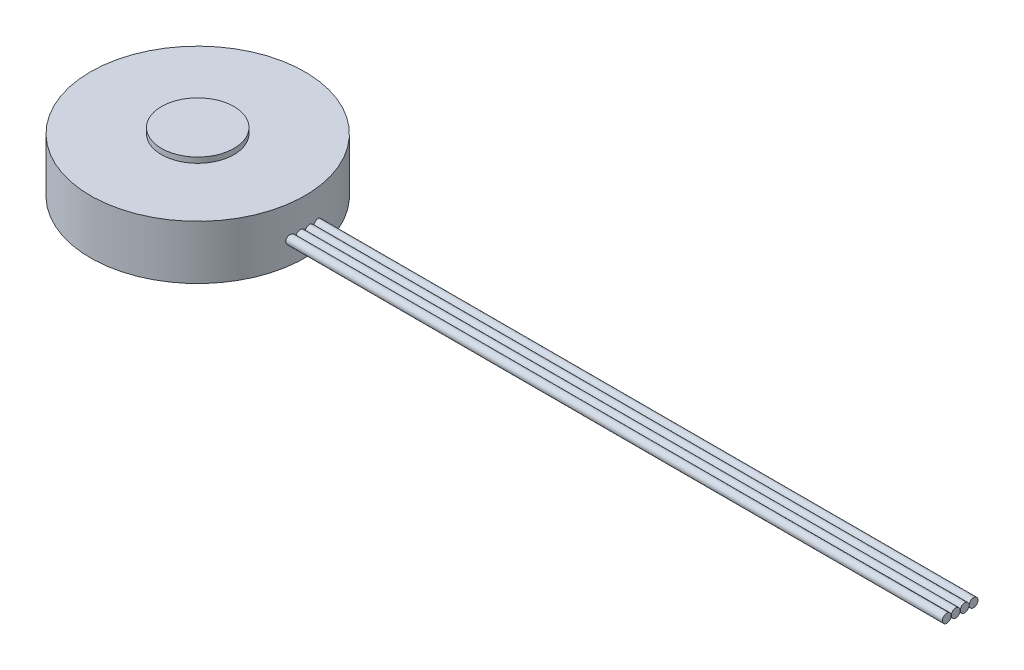
ISO-10303-21;
HEADER;
FILE_DESCRIPTION(('STEP AP214'),'2;1');
FILE_NAME('part.step','',(''),(''),'','','');
FILE_SCHEMA(('AUTOMOTIVE_DESIGN { 1 0 10303 214 1 1 1 1 }'));
ENDSEC;
DATA;
#1=APPLICATION_CONTEXT('core data for automotive mechanical design processes');
#2=APPLICATION_PROTOCOL_DEFINITION('international standard','automotive_design',2000,#1);
#3=PRODUCT_CONTEXT('',#1,'mechanical');
#4=PRODUCT('Part','Part','',(#3));
#5=PRODUCT_RELATED_PRODUCT_CATEGORY('part','',(#4));
#6=PRODUCT_DEFINITION_FORMATION('','',#4);
#7=PRODUCT_DEFINITION_CONTEXT('part definition',#1,'design');
#8=PRODUCT_DEFINITION('design','',#6,#7);
#9=PRODUCT_DEFINITION_SHAPE('','',#8);
#10=(LENGTH_UNIT() NAMED_UNIT(*) SI_UNIT(.MILLI.,.METRE.));
#11=(NAMED_UNIT(*) PLANE_ANGLE_UNIT() SI_UNIT($,.RADIAN.));
#12=(NAMED_UNIT(*) SI_UNIT($,.STERADIAN.) SOLID_ANGLE_UNIT());
#13=UNCERTAINTY_MEASURE_WITH_UNIT(LENGTH_MEASURE(1.E-05),#10,'distance_accuracy_value','');
#14=(GEOMETRIC_REPRESENTATION_CONTEXT(3) GLOBAL_UNCERTAINTY_ASSIGNED_CONTEXT((#13)) GLOBAL_UNIT_ASSIGNED_CONTEXT((#10,
#11,#12)) REPRESENTATION_CONTEXT('',''));
#15=CARTESIAN_POINT('',(0.,0.,0.));
#16=DIRECTION('',(0.,0.,1.));
#17=DIRECTION('',(1.,0.,0.));
#18=AXIS2_PLACEMENT_3D('',#15,#16,#17);
#19=CARTESIAN_POINT('',(0.,5.45,0.));
#20=DIRECTION('',(0.,1.,0.));
#21=DIRECTION('',(-1.,0.,0.));
#22=AXIS2_PLACEMENT_3D('',#19,#20,#21);
#23=CYLINDRICAL_SURFACE('',#22,9.85);
#24=CARTESIAN_POINT('',(9.71335549642862,2.05,1.635));
#25=CARTESIAN_POINT('',(9.71335574145579,2.07253117408199,1.63499896580258));
#26=CARTESIAN_POINT('',(9.71367369977142,2.09507858684365,1.63311305803533));
#27=CARTESIAN_POINT('',(9.71493029272329,2.13954715885051,1.62562088433148));
#28=CARTESIAN_POINT('',(9.71586966723387,2.16146753903822,1.62001018353071));
#29=CARTESIAN_POINT('',(9.71832031769955,2.20402672120731,1.60524323753193));
#30=CARTESIAN_POINT('',(9.7198311272243,2.22466655247768,1.59608988386134));
#31=CARTESIAN_POINT('',(9.72334959996296,2.26410512243372,1.57451308879758));
#32=CARTESIAN_POINT('',(9.72535716029743,2.28290424121589,1.56209032448097));
#33=CARTESIAN_POINT('',(9.7297903808073,2.31828370551512,1.53423558785067));
#34=CARTESIAN_POINT('',(9.73221889197438,2.33484745412459,1.51878299502535));
#35=CARTESIAN_POINT('',(9.7373751614499,2.36515467717834,1.48536536934966));
#36=CARTESIAN_POINT('',(9.74010294942703,2.37889787161961,1.46740008735617));
#37=CARTESIAN_POINT('',(9.74577832187313,2.40334803622492,1.42922400309424));
#38=CARTESIAN_POINT('',(9.74872819081091,2.41401572162192,1.40898837376754));
#39=CARTESIAN_POINT('',(9.75470146454301,2.43179770132659,1.3670216547996));
#40=CARTESIAN_POINT('',(9.75772487270384,2.43891183263575,1.34529049661172));
#41=CARTESIAN_POINT('',(9.76375890621295,2.44942760006057,1.30077660200808));
#42=CARTESIAN_POINT('',(9.76676928188469,2.45280207604103,1.27798740889519));
#43=CARTESIAN_POINT('',(9.77265785875394,2.45564476579442,1.23214944308663));
#44=CARTESIAN_POINT('',(9.77553605992163,2.45511297868654,1.20910067033244));
#45=CARTESIAN_POINT('',(9.78107808678261,2.4501490617146,1.16341763666672));
#46=CARTESIAN_POINT('',(9.78374206972336,2.44571982184334,1.14078308130175));
#47=CARTESIAN_POINT('',(9.78879679328326,2.43307779432689,1.09656411038364));
#48=CARTESIAN_POINT('',(9.79118754150388,2.42486511197012,1.07497966562572));
#49=CARTESIAN_POINT('',(9.79564058772652,2.40493831309833,1.0336131932568));
#50=CARTESIAN_POINT('',(9.79770472902949,2.39324500515106,1.01382134117547));
#51=CARTESIAN_POINT('',(9.80149711844438,2.36666424858525,0.976476863174621));
#52=CARTESIAN_POINT('',(9.80322537814041,2.3517769101618,0.958924160037033));
#53=CARTESIAN_POINT('',(9.80632595838217,2.31933377044988,0.926678232411411));
#54=CARTESIAN_POINT('',(9.80770047968811,2.30179560178567,0.911967477215195));
#55=CARTESIAN_POINT('',(9.81010780728022,2.26447880103306,0.88569712340037));
#56=CARTESIAN_POINT('',(9.8111406217609,2.24470022268737,0.87413744921662));
#57=CARTESIAN_POINT('',(9.81286605217397,2.2035564468074,0.854550509585855));
#58=CARTESIAN_POINT('',(9.81356011333075,2.18219844522234,0.846508253315305));
#59=CARTESIAN_POINT('',(9.81462105062981,2.1384287830343,0.834117878664806));
#60=CARTESIAN_POINT('',(9.81498793097606,2.11601713597362,0.829769712819087));
#61=CARTESIAN_POINT('',(9.81539849182161,2.07082574776304,0.824899103336665));
#62=CARTESIAN_POINT('',(9.81544283438808,2.04804685689159,0.824368822821955));
#63=CARTESIAN_POINT('',(9.8152106518989,2.00272342304803,0.827128589264524));
#64=CARTESIAN_POINT('',(9.81493412859922,1.98017887879412,0.830418615314747));
#65=CARTESIAN_POINT('',(9.81405698233417,1.93597482574058,0.840721105705038));
#66=CARTESIAN_POINT('',(9.81345651064714,1.91431490890974,0.847731832516862));
#67=CARTESIAN_POINT('',(9.81192551893674,1.87248247097522,0.865271434723837));
#68=CARTESIAN_POINT('',(9.81099499911285,1.85230994897263,0.87580030799278));
#69=CARTESIAN_POINT('',(9.80879711446168,1.81400494524072,0.900081844415964));
#70=CARTESIAN_POINT('',(9.80752946138749,1.79587422821453,0.913837265055717));
#71=CARTESIAN_POINT('',(9.80465585226066,1.7621815638768,0.944168984549352));
#72=CARTESIAN_POINT('',(9.80304989348301,1.74661963725835,0.960745306125028));
#73=CARTESIAN_POINT('',(9.79950147692846,1.71845941238415,0.99628810424739));
#74=CARTESIAN_POINT('',(9.79755814979077,1.70586897412457,1.01526072048959));
#75=CARTESIAN_POINT('',(9.79335685212602,1.68404901670669,1.05501689080693));
#76=CARTESIAN_POINT('',(9.79109887488722,1.67481956925636,1.0758004835082));
#77=CARTESIAN_POINT('',(9.78629098904468,1.65993090054512,1.11869401930752));
#78=CARTESIAN_POINT('',(9.78373968981753,1.65428959012721,1.14081002228638));
#79=CARTESIAN_POINT('',(9.77840728575854,1.64679460081451,1.18564773704872));
#80=CARTESIAN_POINT('',(9.77562617169506,1.64494107415155,1.20836947313956));
#81=CARTESIAN_POINT('',(9.76988656773616,1.64506218361062,1.25393265592152));
#82=CARTESIAN_POINT('',(9.76692702896161,1.64706214838034,1.27677390378371));
#83=CARTESIAN_POINT('',(9.76093745294898,1.6548768208258,1.32178507691544));
#84=CARTESIAN_POINT('',(9.757907412906,1.66069168052866,1.34395497539424));
#85=CARTESIAN_POINT('',(9.75186632697511,1.67601117666573,1.38711233133906));
#86=CARTESIAN_POINT('',(9.74885545316627,1.68553421643345,1.40809328373897));
#87=CARTESIAN_POINT('',(9.74298487283247,1.70800530827115,1.44815612868549));
#88=CARTESIAN_POINT('',(9.74012516172939,1.72095325654303,1.46723807876072));
#89=CARTESIAN_POINT('',(9.73468132800783,1.7498995690641,1.50293231807898));
#90=CARTESIAN_POINT('',(9.73209685196158,1.76589394594046,1.51954778559338));
#91=CARTESIAN_POINT('',(9.72731654348271,1.80050613726334,1.54985448610853));
#92=CARTESIAN_POINT('',(9.72512078945526,1.81912447960608,1.56354512928768));
#93=CARTESIAN_POINT('',(9.72124258561783,1.85828111198624,1.58747874986094));
#94=CARTESIAN_POINT('',(9.71955584389194,1.87880132530525,1.59775063413169));
#95=CARTESIAN_POINT('',(9.71675702766367,1.92129736973938,1.61468488462944));
#96=CARTESIAN_POINT('',(9.71564421091544,1.94327127908705,1.6213519134879));
#97=CARTESIAN_POINT('',(9.71435259253801,1.97949478389019,1.6290678214648));
#98=CARTESIAN_POINT('',(9.71397947814716,1.99349857266224,1.63128936426203));
#99=CARTESIAN_POINT('',(9.71348085408578,2.02166610088193,1.63425577251514));
#100=CARTESIAN_POINT('',(9.7133553423277,2.03582983898003,1.63500065042078));
#101=CARTESIAN_POINT('',(9.71335549642862,2.05,1.635));
#102=B_SPLINE_CURVE_WITH_KNOTS('',3,(#24,#25,#26,#27,#28,#29,#30,#31,#32,#33,#34,#35,#36,#37,
#38,#39,#40,#41,#42,#43,#44,#45,#46,#47,#48,#49,#50,#51,#52,#53,#54,#55,#56,#57,#58,#59,#60,#61,
#62,#63,#64,#65,#66,#67,#68,#69,#70,#71,#72,#73,#74,#75,#76,#77,#78,#79,#80,#81,#82,#83,#84,#85,
#86,#87,#88,#89,#90,#91,#92,#93,#94,#95,#96,#97,#98,#99,#100,#101),.UNSPECIFIED.,.T.,.F.,(4,2,2,
2,2,2,2,2,2,2,2,2,2,2,2,2,2,2,2,2,2,2,2,2,2,2,2,2,2,2,2,2,2,2,2,2,2,2,4),(0.,0.0675413942538421,
0.135163350141083,0.202730228719375,0.270283125572725,0.338312819499713,0.406349263629962,
0.475219732724226,0.544093360558278,0.613463986491112,0.682834628066087,0.752153874054574,
0.821471191092761,0.890382151754412,0.959290735347516,1.0277596375547,1.09622689768494,
1.16439944535848,1.23257111706231,1.30060281447497,1.36863413957827,1.43663372268509,
1.50463326469613,1.57269113387005,1.64074955126251,1.70898602393598,1.77722395237447,
1.84579988365936,1.91437857097153,1.98340955780983,2.05244329576411,2.12182409999883,
2.19120280176246,2.26049131233801,2.32979378250857,2.39849443469652,2.46710601347003,
2.50958407066298,2.5520617697215),.UNSPECIFIED.);
#103=CARTESIAN_POINT('',(9.71335549642862,2.05,1.635));
#104=VERTEX_POINT('',#103);
#105=EDGE_CURVE('E106',#104,#104,#102,.T.);
#106=ORIENTED_EDGE('',*,*,#105,.T.);
#107=EDGE_LOOP('',(#106));
#108=FACE_BOUND('',#107,.T.);
#109=CARTESIAN_POINT('',(9.8162250891063,2.05,0.815000000000001));
#110=CARTESIAN_POINT('',(9.81622524391361,2.072699105565,0.814998988575934));
#111=CARTESIAN_POINT('',(9.81638465174909,2.09541445370467,0.813085174061798));
#112=CARTESIAN_POINT('',(9.81701168638832,2.14021786713435,0.805478458719045));
#113=CARTESIAN_POINT('',(9.81747967919996,2.16230515500103,0.799781070194063));
#114=CARTESIAN_POINT('',(9.81869071855766,2.20519592624566,0.784773160682826));
#115=CARTESIAN_POINT('',(9.81943360896361,2.22600013059607,0.7754646906233));
#116=CARTESIAN_POINT('',(9.82114314201561,2.26574413060589,0.753503879764022));
#117=CARTESIAN_POINT('',(9.82210973271068,2.28468435769215,0.740852315250166));
#118=CARTESIAN_POINT('',(9.82420452871451,2.32021163694231,0.712535430577097));
#119=CARTESIAN_POINT('',(9.82533305484216,2.33679388457337,0.696864106162347));
#120=CARTESIAN_POINT('',(9.82767839682713,2.36709540998678,0.662967089601182));
#121=CARTESIAN_POINT('',(9.82889521734387,2.38081453652996,0.64474126260276));
#122=CARTESIAN_POINT('',(9.83134766892478,2.4050361352684,0.60619824531849));
#123=CARTESIAN_POINT('',(9.83258334105777,2.41553004913187,0.585875678606686));
#124=CARTESIAN_POINT('',(9.835002625942,2.43295490779656,0.543753566219916));
#125=CARTESIAN_POINT('',(9.83618623859218,2.4398858456815,0.521954017678));
#126=CARTESIAN_POINT('',(9.83844518208222,2.44998858687141,0.477485055232383));
#127=CARTESIAN_POINT('',(9.83952046603132,2.45315876865265,0.45481527045509));
#128=CARTESIAN_POINT('',(9.84152056028401,2.45564124997275,0.409258870169951));
#129=CARTESIAN_POINT('',(9.84244537207349,2.45495358761007,0.386372256805641));
#130=CARTESIAN_POINT('',(9.84411937288658,2.44974051281671,0.341067461060588));
#131=CARTESIAN_POINT('',(9.84486881456802,2.44522066544248,0.318648647692031));
#132=CARTESIAN_POINT('',(9.84618800173336,2.43247639082512,0.274884381928466));
#133=CARTESIAN_POINT('',(9.84675774843161,2.4242519886177,0.253538922280727));
#134=CARTESIAN_POINT('',(9.84772757946389,2.40434503355158,0.212559424318803));
#135=CARTESIAN_POINT('',(9.84812789963788,2.3926673264038,0.192923037460092));
#136=CARTESIAN_POINT('',(9.84878382121464,2.36618039121401,0.15588731389532));
#137=CARTESIAN_POINT('',(9.8490394229238,2.35137116980174,0.138487972453335));
#138=CARTESIAN_POINT('',(9.84943810730411,2.31904655632462,0.106426279360278));
#139=CARTESIAN_POINT('',(9.84958122446829,2.30153199581577,0.0917630897299524));
#140=CARTESIAN_POINT('',(9.84979039115677,2.26429035331553,0.065583502333589));
#141=CARTESIAN_POINT('',(9.84985644056823,2.24456326808428,0.0540671091756));
#142=CARTESIAN_POINT('',(9.84994444546132,2.20345039453282,0.0345051837520488));
#143=CARTESIAN_POINT('',(9.8499663884657,2.18206413862685,0.0264606341405292));
#144=CARTESIAN_POINT('',(9.84999190658725,2.13824473496119,0.0140754473755114));
#145=CARTESIAN_POINT('',(9.84999548169072,2.11581158642085,0.00973481298404161));
#146=CARTESIAN_POINT('',(9.84999909700742,2.07053111197159,0.00488022412616352));
#147=CARTESIAN_POINT('',(9.84999913661919,2.04768371625193,0.00436692078134201));
#148=CARTESIAN_POINT('',(9.84999747742798,2.00222701635242,0.00718328777099775));
#149=CARTESIAN_POINT('',(9.84999577862401,1.97961771230704,0.0105129602760017));
#150=CARTESIAN_POINT('',(9.84997914307543,1.93527863077319,0.0209208496073674));
#151=CARTESIAN_POINT('',(9.84996420611379,1.91354886770968,0.0279991278862054));
#152=CARTESIAN_POINT('',(9.84989792410908,1.87158613858041,0.0457033203718263));
#153=CARTESIAN_POINT('',(9.84984657906304,1.85135317263649,0.0563292348673761));
#154=CARTESIAN_POINT('',(9.84967596140878,1.812959302442,0.0808264339496936));
#155=CARTESIAN_POINT('',(9.84955669152088,1.79479831524526,0.0946975885540415));
#156=CARTESIAN_POINT('',(9.84921496809676,1.76106324352668,0.125291280900943));
#157=CARTESIAN_POINT('',(9.84899251474781,1.74548915430963,0.142013813468153));
#158=CARTESIAN_POINT('',(9.8484108621163,1.71737348615823,0.177830225737179));
#159=CARTESIAN_POINT('',(9.84805169564006,1.70483118088221,0.19692353579587));
#160=CARTESIAN_POINT('',(9.84717009587685,1.68312982105878,0.236941170242122));
#161=CARTESIAN_POINT('',(9.84664766328334,1.67397075214131,0.257865486852144));
#162=CARTESIAN_POINT('',(9.84542512650915,1.65929586765098,0.300945072901168));
#163=CARTESIAN_POINT('',(9.84472505905842,1.65377929975828,0.323100087127203));
#164=CARTESIAN_POINT('',(9.84314835168368,1.64654028139698,0.368015360980864));
#165=CARTESIAN_POINT('',(9.84227171098546,1.64481784756482,0.390775623261923));
#166=CARTESIAN_POINT('',(9.84036009740763,1.64521279868552,0.436270382381214));
#167=CARTESIAN_POINT('',(9.83932502515646,1.6473326026805,0.459004853963974));
#168=CARTESIAN_POINT('',(9.83713361809784,1.65535351151419,0.503790690442848));
#169=CARTESIAN_POINT('',(9.83597728177067,1.6612546637473,0.525842046773349));
#170=CARTESIAN_POINT('',(9.83359397676732,1.67668191518471,0.56867451671486));
#171=CARTESIAN_POINT('',(9.83236689666737,1.68621387315219,0.589453513977897));
#172=CARTESIAN_POINT('',(9.82990893664627,1.70863139579634,0.629114930929926));
#173=CARTESIAN_POINT('',(9.82867805683573,1.72151686374141,0.647997405302123));
#174=CARTESIAN_POINT('',(9.82628349021701,1.7502924218886,0.683350252281516));
#175=CARTESIAN_POINT('',(9.82511987034557,1.76618544019896,0.699818246220393));
#176=CARTESIAN_POINT('',(9.82293432096906,1.80052463201626,0.729855316359027));
#177=CARTESIAN_POINT('',(9.82191242556972,1.81897141795595,0.743423695195161));
#178=CARTESIAN_POINT('',(9.82007928215529,1.85787657463222,0.767258850230474));
#179=CARTESIAN_POINT('',(9.81926788660067,1.87833352250313,0.777527940114323));
#180=CARTESIAN_POINT('',(9.8179115632719,1.92067418862203,0.794471823319867));
#181=CARTESIAN_POINT('',(9.81736631381863,1.9425561480651,0.801150956657412));
#182=CARTESIAN_POINT('',(9.81672577597017,1.97881448512574,0.808952087041424));
#183=CARTESIAN_POINT('',(9.81653854946733,1.99295355671002,0.811217138474301));
#184=CARTESIAN_POINT('',(9.81628815738994,2.0213929349798,0.814241411988832));
#185=CARTESIAN_POINT('',(9.81622499153458,2.03569324130026,0.815000637478866));
#186=CARTESIAN_POINT('',(9.8162250891063,2.05,0.815000000000001));
#187=B_SPLINE_CURVE_WITH_KNOTS('',3,(#109,#110,#111,#112,#113,#114,#115,#116,#117,#118,#119,
#120,#121,#122,#123,#124,#125,#126,#127,#128,#129,#130,#131,#132,#133,#134,#135,#136,#137,#138,
#139,#140,#141,#142,#143,#144,#145,#146,#147,#148,#149,#150,#151,#152,#153,#154,#155,#156,#157,
#158,#159,#160,#161,#162,#163,#164,#165,#166,#167,#168,#169,#170,#171,#172,#173,#174,#175,#176,
#177,#178,#179,#180,#181,#182,#183,#184,#185,#186),.UNSPECIFIED.,.T.,.F.,(4,2,2,2,2,2,2,2,2,2,2,
2,2,2,2,2,2,2,2,2,2,2,2,2,2,2,2,2,2,2,2,2,2,2,2,2,2,2,4),(0.,0.0680450082488815,
0.136170869162367,0.204258094262349,0.272329522986474,0.340537722906674,0.408749524889986,
0.477140799345817,0.545532206558867,0.613953091362672,0.682373300471607,0.750694320358858,
0.819014878533807,0.887240019901625,0.955465016831425,1.02366908462139,1.09187325228625,
1.16009671149367,1.22832022157562,1.29655533786207,1.36479049268798,1.43302676615621,
1.50126304517866,1.569496591584,1.63773001414457,1.70594707339927,1.77416384290348,
1.84236651854858,1.91056949324649,1.97881542290651,2.04706220795927,2.11541958755485,
2.18377499560852,2.25219729912754,2.32063603988343,2.38902668147249,2.45733445634457,
2.50022186062784,2.54310916783698),.UNSPECIFIED.);
#188=CARTESIAN_POINT('',(9.8162250891063,2.05,0.815000000000001));
#189=VERTEX_POINT('',#188);
#190=EDGE_CURVE('E60',#189,#189,#187,.T.);
#191=ORIENTED_EDGE('',*,*,#190,.T.);
#192=EDGE_LOOP('',(#191));
#193=FACE_BOUND('',#192,.T.);
#194=CARTESIAN_POINT('',(0.,0.,0.));
#195=DIRECTION('',(0.,1.,0.));
#196=DIRECTION('',(-1.,0.,0.));
#197=AXIS2_PLACEMENT_3D('',#194,#195,#196);
#198=CIRCLE('',#197,9.85);
#199=CARTESIAN_POINT('',(-9.85,0.,0.));
#200=VERTEX_POINT('',#199);
#201=EDGE_CURVE('E10',#200,#200,#198,.T.);
#202=ORIENTED_EDGE('',*,*,#201,.T.);
#203=EDGE_LOOP('',(#202));
#204=FACE_BOUND('',#203,.T.);
#205=CARTESIAN_POINT('',(0.,4.95,0.));
#206=DIRECTION('',(0.,1.,0.));
#207=DIRECTION('',(-1.,0.,0.));
#208=AXIS2_PLACEMENT_3D('',#205,#206,#207);
#209=CIRCLE('',#208,9.85);
#210=CARTESIAN_POINT('',(-9.85,4.95,0.));
#211=VERTEX_POINT('',#210);
#212=EDGE_CURVE('E50',#211,#211,#209,.T.);
#213=ORIENTED_EDGE('',*,*,#212,.F.);
#214=EDGE_LOOP('',(#213));
#215=FACE_BOUND('',#214,.T.);
#216=CARTESIAN_POINT('',(9.81538970189162,2.05,-0.825000000000001));
#217=CARTESIAN_POINT('',(9.81538968784632,2.07268157240535,-0.82500100740413));
#218=CARTESIAN_POINT('',(9.81522958794618,2.09537936304278,-0.826911858560377));
#219=CARTESIAN_POINT('',(9.8145867103522,2.14014890062508,-0.834506842021475));
#220=CARTESIAN_POINT('',(9.81410355003495,2.16221987283329,-0.840195448536056));
#221=CARTESIAN_POINT('',(9.81280914151059,2.20508038013398,-0.85518008472261));
#222=CARTESIAN_POINT('',(9.81199806242837,2.22587056943337,-0.864474254716718));
#223=CARTESIAN_POINT('',(9.81004172991731,2.26558586339044,-0.886398210076817));
#224=CARTESIAN_POINT('',(9.8088965581945,2.28451142255185,-0.899027179809334));
#225=CARTESIAN_POINT('',(9.80626671293763,2.31999196756778,-0.927272315265095));
#226=CARTESIAN_POINT('',(9.80478165813699,2.33654425701379,-0.942891832418327));
#227=CARTESIAN_POINT('',(9.80147569565319,2.36679139008872,-0.976658265241475));
#228=CARTESIAN_POINT('',(9.79965477137382,2.38048609244536,-0.994805305792199));
#229=CARTESIAN_POINT('',(9.79568447341411,2.40468091329785,-1.03316902390504));
#230=CARTESIAN_POINT('',(9.79353403301301,2.41517031283609,-1.05339235008548));
#231=CARTESIAN_POINT('',(9.78893792406715,2.4326097189326,-1.09527980970308));
#232=CARTESIAN_POINT('',(9.78649224778477,2.43955963270236,-1.11694398089553));
#233=CARTESIAN_POINT('',(9.78133701637007,2.44976781251287,-1.16122587695827));
#234=CARTESIAN_POINT('',(9.7786260448291,2.45300494197763,-1.18384830852505));
#235=CARTESIAN_POINT('',(9.77301713123282,2.45563850660808,-1.22929261482654));
#236=CARTESIAN_POINT('',(9.77011918187469,2.45503479167138,-1.25211449732109));
#237=CARTESIAN_POINT('',(9.7641998851404,2.4499960944763,-1.29746951019037));
#238=CARTESIAN_POINT('',(9.76117785265491,2.44553599041447,-1.31999976198632));
#239=CARTESIAN_POINT('',(9.75512880459395,2.43287958297366,-1.3639850480109));
#240=CARTESIAN_POINT('',(9.75210178885532,2.42468315472724,-1.3854400462781));
#241=CARTESIAN_POINT('',(9.74614478920366,2.40474555567853,-1.42674422748329));
#242=CARTESIAN_POINT('',(9.74321518141858,2.3929920953347,-1.44658753562771));
#243=CARTESIAN_POINT('',(9.73758452051596,2.36627368291988,-1.48401700496116));
#244=CARTESIAN_POINT('',(9.73488346527459,2.35130876069622,-1.50160318712549));
#245=CARTESIAN_POINT('',(9.72983990844005,2.31864383647869,-1.53394354843081));
#246=CARTESIAN_POINT('',(9.72749607464278,2.3009545172576,-1.54870830471844));
#247=CARTESIAN_POINT('',(9.72326587764755,2.26329357139565,-1.57504896431404));
#248=CARTESIAN_POINT('',(9.72137948607615,2.24332208642205,-1.58662506540836));
#249=CARTESIAN_POINT('',(9.71817669081798,2.20189783448525,-1.6061254175176));
#250=CARTESIAN_POINT('',(9.71685422656332,2.18046384709363,-1.61408856001773));
#251=CARTESIAN_POINT('',(9.71481738962096,2.13653577266743,-1.62630311410424));
#252=CARTESIAN_POINT('',(9.71410297065175,2.11404176645403,-1.63055480818907));
#253=CARTESIAN_POINT('',(9.71332443744443,2.06891306783304,-1.63518619535631));
#254=CARTESIAN_POINT('',(9.71325284920121,2.04628306203186,-1.63561038993889));
#255=CARTESIAN_POINT('',(9.71374411928134,2.00127510292916,-1.63269020633704));
#256=CARTESIAN_POINT('',(9.71430695689795,1.97889714142535,-1.62934595114934));
#257=CARTESIAN_POINT('',(9.71603453693385,1.93511432693485,-1.61901200880438));
#258=CARTESIAN_POINT('',(9.71719699546354,1.91370611448462,-1.61203615308445));
#259=CARTESIAN_POINT('',(9.72006405971874,1.87236883016733,-1.59465726434174));
#260=CARTESIAN_POINT('',(9.72176868121035,1.85243980133571,-1.58425413165341));
#261=CARTESIAN_POINT('',(9.72565109464137,1.81447441303924,-1.56024329418279));
#262=CARTESIAN_POINT('',(9.72783205627451,1.79645199422709,-1.5466140686237));
#263=CARTESIAN_POINT('',(9.73255905810198,1.76294369409537,-1.51658322762963));
#264=CARTESIAN_POINT('',(9.73510512230648,1.74745797974016,-1.50018142984987));
#265=CARTESIAN_POINT('',(9.74048469955602,1.71926082081272,-1.4648482703666));
#266=CARTESIAN_POINT('',(9.74332136762448,1.70658590712764,-1.44588823298037));
#267=CARTESIAN_POINT('',(9.74913848280367,1.68459707096098,-1.40613017150667));
#268=CARTESIAN_POINT('',(9.7521189379173,1.6752833358009,-1.38533204506123));
#269=CARTESIAN_POINT('',(9.75813926754981,1.66019849880032,-1.34227217634015));
#270=CARTESIAN_POINT('',(9.76117943724205,1.65446150313764,-1.31999851885833));
#271=CARTESIAN_POINT('',(9.76718612682563,1.64683236381449,-1.27479210779127));
#272=CARTESIAN_POINT('',(9.77015264539556,1.64494028908879,-1.25185934239651));
#273=CARTESIAN_POINT('',(9.77592615717588,1.64506268528898,-1.20594525621525));
#274=CARTESIAN_POINT('',(9.77873288151604,1.6470835511591,-1.18296391736328));
#275=CARTESIAN_POINT('',(9.78410826573741,1.6549995625504,-1.13764941693892));
#276=CARTESIAN_POINT('',(9.78667693043838,1.66089462961474,-1.11531624225005));
#277=CARTESIAN_POINT('',(9.79151064985154,1.67636632844094,-1.07204999997293));
#278=CARTESIAN_POINT('',(9.79377709300681,1.68592528284683,-1.05111076768367));
#279=CARTESIAN_POINT('',(9.79798578687672,1.70846454337866,-1.01112764206851));
#280=CARTESIAN_POINT('',(9.79992806138832,1.72144459818377,-0.992083609658973));
#281=CARTESIAN_POINT('',(9.80345805095943,1.75036321068288,-0.956570524801299));
#282=CARTESIAN_POINT('',(9.80504806571993,1.76628125555978,-0.940084994798392));
#283=CARTESIAN_POINT('',(9.80788473158625,1.80068870124374,-0.910014215709678));
#284=CARTESIAN_POINT('',(9.80913130771187,1.81917866223261,-0.896429600102487));
#285=CARTESIAN_POINT('',(9.81127804360541,1.85810664821574,-0.872620112382552));
#286=CARTESIAN_POINT('',(9.8121797650533,1.87853535537499,-0.862380125608636));
#287=CARTESIAN_POINT('',(9.81365027380695,1.92081599550373,-0.845482658234124));
#288=CARTESIAN_POINT('',(9.81421946185098,1.94266617998581,-0.838820866310791));
#289=CARTESIAN_POINT('',(9.81488085227623,1.97887907900859,-0.831036863026727));
#290=CARTESIAN_POINT('',(9.81507171425628,1.99300546671483,-0.828775949912816));
#291=CARTESIAN_POINT('',(9.81532614340499,2.02141908946403,-0.825757201970625));
#292=CARTESIAN_POINT('',(9.8153897107428,2.03570632429324,-0.824999365145076));
#293=CARTESIAN_POINT('',(9.81538970189162,2.05,-0.825000000000001));
#294=B_SPLINE_CURVE_WITH_KNOTS('',3,(#216,#217,#218,#219,#220,#221,#222,#223,#224,#225,#226,
#227,#228,#229,#230,#231,#232,#233,#234,#235,#236,#237,#238,#239,#240,#241,#242,#243,#244,#245,
#246,#247,#248,#249,#250,#251,#252,#253,#254,#255,#256,#257,#258,#259,#260,#261,#262,#263,#264,
#265,#266,#267,#268,#269,#270,#271,#272,#273,#274,#275,#276,#277,#278,#279,#280,#281,#282,#283,
#284,#285,#286,#287,#288,#289,#290,#291,#292,#293),.UNSPECIFIED.,.T.,.F.,(4,2,2,2,2,2,2,2,2,2,2,
2,2,2,2,2,2,2,2,2,2,2,2,2,2,2,2,2,2,2,2,2,2,2,2,2,2,2,4),(0.,0.0679925124479529,
0.136065696238657,0.204103815817841,0.272125309856143,0.340223484821439,0.408325025600837,
0.476651875608582,0.544980516729703,0.613696246007336,0.682414660751369,0.751584131963095,
0.8207559149788,0.890169468963887,0.959582377847562,1.02872973006808,1.09787279224088,
1.16625280055255,1.23462760363729,1.30220638866348,1.36978296807995,1.43710403585229,
1.50442706150029,1.57221251634053,1.64000243098778,1.70862754798364,1.77725648892867,
1.84653021818324,1.91580518942082,1.98519347275922,2.05458035095173,2.12363658486515,
2.19268774718376,2.26127388249727,2.3298749798242,2.39816162983814,2.46636581648602,
2.50921400167579,2.5520621299294),.UNSPECIFIED.);
#295=CARTESIAN_POINT('',(9.81538970189162,2.05,-0.825000000000001));
#296=VERTEX_POINT('',#295);
#297=EDGE_CURVE('E70',#296,#296,#294,.T.);
#298=ORIENTED_EDGE('',*,*,#297,.T.);
#299=EDGE_LOOP('',(#298));
#300=FACE_BOUND('',#299,.T.);
#301=CARTESIAN_POINT('',(9.84999873096439,2.05,-0.00500000000000034));
#302=CARTESIAN_POINT('',(9.84999880118701,2.07274898425352,-0.00500100236253597));
#303=CARTESIAN_POINT('',(9.8499983364759,2.09551420551982,-0.00692313155469145));
#304=CARTESIAN_POINT('',(9.84998994527511,2.14041742345973,-0.0145641294858808));
#305=CARTESIAN_POINT('',(9.84998200993318,2.16255464392845,-0.0202875000968124));
#306=CARTESIAN_POINT('',(9.8499393720995,2.20554531216489,-0.0353680658463601));
#307=CARTESIAN_POINT('',(9.84990468212474,2.22639935533476,-0.0447235607003306));
#308=CARTESIAN_POINT('',(9.84977964037562,2.2662349582045,-0.066800401721755));
#309=CARTESIAN_POINT('',(9.84968930222328,2.28521697483529,-0.0795209237361379));
#310=CARTESIAN_POINT('',(9.84941849356733,2.32077668197844,-0.107967875364568));
#311=CARTESIAN_POINT('',(9.84923802057024,2.33735430595965,-0.123694388128497));
#312=CARTESIAN_POINT('',(9.84875206720744,2.36763418809714,-0.157706575426032));
#313=CARTESIAN_POINT('',(9.84844658239969,2.38133634405367,-0.175992340881991));
#314=CARTESIAN_POINT('',(9.84768097339137,2.40547198934871,-0.214596069590709));
#315=CARTESIAN_POINT('',(9.84722089723361,2.41590649224153,-0.234913400111733));
#316=CARTESIAN_POINT('',(9.8461266566344,2.43321748643396,-0.277006635311823));
#317=CARTESIAN_POINT('',(9.84549249290578,2.44009399230211,-0.298782534018237));
#318=CARTESIAN_POINT('',(9.84404516602289,2.45009594187518,-0.343172898737659));
#319=CARTESIAN_POINT('',(9.84323200792573,2.45322149153944,-0.365787341044361));
#320=CARTESIAN_POINT('',(9.84143892557263,2.45563638758152,-0.411213456822957));
#321=CARTESIAN_POINT('',(9.84045900071318,2.45492572007641,-0.434025131008319));
#322=CARTESIAN_POINT('',(9.83836154507904,2.44968897603643,-0.479222878731825));
#323=CARTESIAN_POINT('',(9.83724387762277,2.44515908324035,-0.501608503664551));
#324=CARTESIAN_POINT('',(9.83491883961142,2.43240973387614,-0.545298381749966));
#325=CARTESIAN_POINT('',(9.83371146789877,2.42419022968939,-0.566602620942195));
#326=CARTESIAN_POINT('',(9.83126588797451,2.40427837370386,-0.607563293967444));
#327=CARTESIAN_POINT('',(9.83002763187225,2.39258027589275,-0.627216931874703));
#328=CARTESIAN_POINT('',(9.82759258643694,2.36604673372647,-0.664281172257328));
#329=CARTESIAN_POINT('',(9.82639579733588,2.35121127182104,-0.681691762184331));
#330=CARTESIAN_POINT('',(9.82411685056771,2.3188129534479,-0.713784025945789));
#331=CARTESIAN_POINT('',(9.82303474948775,2.30124876106371,-0.728464355338601));
#332=CARTESIAN_POINT('',(9.82105658976846,2.26389446335111,-0.754665934107861));
#333=CARTESIAN_POINT('',(9.82016052920291,2.24410438107222,-0.766187216192607));
#334=CARTESIAN_POINT('',(9.81861703456825,2.20289983673089,-0.785719932823534));
#335=CARTESIAN_POINT('',(9.81796912270447,2.18148859234043,-0.793738116598442));
#336=CARTESIAN_POINT('',(9.81696480814072,2.13761716566312,-0.806064850060866));
#337=CARTESIAN_POINT('',(9.81660839975954,2.11515700382806,-0.810373472045584));
#338=CARTESIAN_POINT('',(9.81621304750233,2.06989703642818,-0.815148603867403));
#339=CARTESIAN_POINT('',(9.81617316053375,2.04709844277735,-0.815626527519064));
#340=CARTESIAN_POINT('',(9.81641120574263,2.00174521478887,-0.812756443991933));
#341=CARTESIAN_POINT('',(9.81668913513325,1.97919057831378,-0.80940847036151));
#342=CARTESIAN_POINT('',(9.81754260393092,1.93499056469836,-0.798989495755022));
#343=CARTESIAN_POINT('',(9.81811781739473,1.91334421974971,-0.791922572093758));
#344=CARTESIAN_POINT('',(9.81952552730677,1.87154562662928,-0.774271498564311));
#345=CARTESIAN_POINT('',(9.8203580263204,1.85139339335781,-0.763687313625352));
#346=CARTESIAN_POINT('',(9.82222553616281,1.81311201444617,-0.739280080975705));
#347=CARTESIAN_POINT('',(9.82326093475124,1.79498684856546,-0.725450821478959));
#348=CARTESIAN_POINT('',(9.82546526408037,1.76131260387351,-0.694957135315945));
#349=CARTESIAN_POINT('',(9.82663419723239,1.74576357159378,-0.678292657449452));
#350=CARTESIAN_POINT('',(9.82903640461246,1.717635110288,-0.642545406411104));
#351=CARTESIAN_POINT('',(9.83026985892871,1.70506460114153,-0.62345562592687));
#352=CARTESIAN_POINT('',(9.83272617308017,1.68330699693355,-0.58343585443154));
#353=CARTESIAN_POINT('',(9.8339490328401,1.67411992589509,-0.562505850355822));
#354=CARTESIAN_POINT('',(9.83632154797882,1.65938085118017,-0.519369963724174));
#355=CARTESIAN_POINT('',(9.83747111204403,1.6538333047991,-0.497162552788815));
#356=CARTESIAN_POINT('',(9.8396438481137,1.64655133111578,-0.45212499308908));
#357=CARTESIAN_POINT('',(9.8406670205897,1.64481688958702,-0.429294846648424));
#358=CARTESIAN_POINT('',(9.84255078646898,1.64521352913582,-0.383685325575265));
#359=CARTESIAN_POINT('',(9.84341154918818,1.64734055968296,-0.360905922807317));
#360=CARTESIAN_POINT('',(9.84495474486014,1.65539496301681,-0.316022929733137));
#361=CARTESIAN_POINT('',(9.84563717907409,1.6613223089254,-0.293919334648346));
#362=CARTESIAN_POINT('',(9.84682342972589,1.6767984692367,-0.251053298324946));
#363=CARTESIAN_POINT('',(9.84732752796309,1.68634152037429,-0.230288783972358));
#364=CARTESIAN_POINT('',(9.84817465674185,1.70877965422042,-0.190655027631479));
#365=CARTESIAN_POINT('',(9.84851769407292,1.72167459559506,-0.171785705778077));
#366=CARTESIAN_POINT('',(9.84907009518954,1.75043964594885,-0.136492226521822));
#367=CARTESIAN_POINT('',(9.84927955938508,1.76630750847801,-0.120066239547605));
#368=CARTESIAN_POINT('',(9.8495992895985,1.80057965228833,-0.0901053414405952));
#369=CARTESIAN_POINT('',(9.84970953126052,1.81898455505151,-0.0765711407674997));
#370=CARTESIAN_POINT('',(9.84986582982309,1.85781554818445,-0.0527756554329244));
#371=CARTESIAN_POINT('',(9.84991184392944,1.87824297644673,-0.0425165564463202));
#372=CARTESIAN_POINT('',(9.84997044800265,1.92051420171057,-0.0255840059173333));
#373=CARTESIAN_POINT('',(9.84998307745635,1.94235629409855,-0.0189063257896574));
#374=CARTESIAN_POINT('',(9.84999419627178,1.97861201932209,-0.0110825718136803));
#375=CARTESIAN_POINT('',(9.84999618441067,1.99279140913616,-0.00880448452819095));
#376=CARTESIAN_POINT('',(9.84999842961304,2.02131171313974,-0.00576288241225314));
#377=CARTESIAN_POINT('',(9.84999868667625,2.03565262735552,-0.00499936782809045));
#378=CARTESIAN_POINT('',(9.84999873096439,2.05,-0.00500000000000034));
#379=B_SPLINE_CURVE_WITH_KNOTS('',3,(#301,#302,#303,#304,#305,#306,#307,#308,#309,#310,#311,
#312,#313,#314,#315,#316,#317,#318,#319,#320,#321,#322,#323,#324,#325,#326,#327,#328,#329,#330,
#331,#332,#333,#334,#335,#336,#337,#338,#339,#340,#341,#342,#343,#344,#345,#346,#347,#348,#349,
#350,#351,#352,#353,#354,#355,#356,#357,#358,#359,#360,#361,#362,#363,#364,#365,#366,#367,#368,
#369,#370,#371,#372,#373,#374,#375,#376,#377,#378),.UNSPECIFIED.,.T.,.F.,(4,2,2,2,2,2,2,2,2,2,2,
2,2,2,2,2,2,2,2,2,2,2,2,2,2,2,2,2,2,2,2,2,2,2,2,2,2,2,4),(0.,0.0681946189989471,
0.136470146352224,0.20471375075397,0.272940656572074,0.341169449914418,0.409400667830889,
0.477610700909614,0.545820454694,0.614028281601528,0.682236355347524,0.750512665116996,
0.818789856095094,0.887180461222116,0.955571448932524,1.02399602524716,1.09241989307735,
1.16071134468958,1.22900146531104,1.29708803515992,1.3651740079787,1.43318548897724,
1.50119764814178,1.56934107515321,1.63748573287378,1.70583195676687,1.77417866592147,
1.84260892323623,1.91103892524042,1.97939718836826,2.04775496803082,2.11600424387601,
2.18425064242768,2.25244567794034,2.32065744852632,2.38891464627853,2.45709107426418,
2.50010017924759,2.54310929122475),.UNSPECIFIED.);
#380=CARTESIAN_POINT('',(9.84999873096439,2.05,-0.00500000000000034));
#381=VERTEX_POINT('',#380);
#382=EDGE_CURVE('E41',#381,#381,#379,.T.);
#383=ORIENTED_EDGE('',*,*,#382,.T.);
#384=EDGE_LOOP('',(#383));
#385=FACE_BOUND('',#384,.T.);
#386=ADVANCED_FACE('F37',(#108,#193,#204,#215,#300,#385),#23,.T.);
#387=CARTESIAN_POINT('',(0.,0.,0.));
#388=DIRECTION('',(0.,-1.,0.));
#389=DIRECTION('',(1.,0.,0.));
#390=AXIS2_PLACEMENT_3D('',#387,#388,#389);
#391=PLANE('',#390);
#392=ORIENTED_EDGE('',*,*,#201,.F.);
#393=EDGE_LOOP('',(#392));
#394=FACE_BOUND('',#393,.T.);
#395=ADVANCED_FACE('F39',(#394),#391,.T.);
#396=CARTESIAN_POINT('',(-9.85,4.95,0.));
#397=DIRECTION('',(0.,1.,0.));
#398=DIRECTION('',(-1.,0.,0.));
#399=AXIS2_PLACEMENT_3D('',#396,#397,#398);
#400=PLANE('',#399);
#401=ORIENTED_EDGE('',*,*,#212,.T.);
#402=EDGE_LOOP('',(#401));
#403=FACE_BOUND('',#402,.T.);
#404=CARTESIAN_POINT('',(0.,4.95,0.));
#405=DIRECTION('',(0.,1.,0.));
#406=DIRECTION('',(-1.,0.,0.));
#407=AXIS2_PLACEMENT_3D('',#404,#405,#406);
#408=CIRCLE('',#407,3.32899159663866);
#409=CARTESIAN_POINT('',(-3.32899159663866,4.95,0.));
#410=VERTEX_POINT('',#409);
#411=EDGE_CURVE('E56',#410,#410,#408,.T.);
#412=ORIENTED_EDGE('',*,*,#411,.F.);
#413=EDGE_LOOP('',(#412));
#414=FACE_BOUND('',#413,.T.);
#415=ADVANCED_FACE('F90',(#403,#414),#400,.T.);
#416=CARTESIAN_POINT('',(0.,5.45,0.));
#417=DIRECTION('',(0.,1.,0.));
#418=DIRECTION('',(-1.,0.,0.));
#419=AXIS2_PLACEMENT_3D('',#416,#417,#418);
#420=CYLINDRICAL_SURFACE('',#419,3.32899159663866);
#421=ORIENTED_EDGE('',*,*,#411,.T.);
#422=EDGE_LOOP('',(#421));
#423=FACE_BOUND('',#422,.T.);
#424=CARTESIAN_POINT('',(0.,5.45,0.));
#425=DIRECTION('',(0.,1.,0.));
#426=DIRECTION('',(-1.,0.,0.));
#427=AXIS2_PLACEMENT_3D('',#424,#425,#426);
#428=CIRCLE('',#427,3.32899159663866);
#429=CARTESIAN_POINT('',(-3.32899159663866,5.45,0.));
#430=VERTEX_POINT('',#429);
#431=EDGE_CURVE('E68',#430,#430,#428,.T.);
#432=ORIENTED_EDGE('',*,*,#431,.F.);
#433=EDGE_LOOP('',(#432));
#434=FACE_BOUND('',#433,.T.);
#435=ADVANCED_FACE('F87',(#423,#434),#420,.T.);
#436=CARTESIAN_POINT('',(-3.32899159663866,5.45,0.));
#437=DIRECTION('',(0.,1.,0.));
#438=DIRECTION('',(-1.,0.,0.));
#439=AXIS2_PLACEMENT_3D('',#436,#437,#438);
#440=PLANE('',#439);
#441=ORIENTED_EDGE('',*,*,#431,.T.);
#442=EDGE_LOOP('',(#441));
#443=FACE_BOUND('',#442,.T.);
#444=ADVANCED_FACE('F83',(#443),#440,.T.);
#445=CARTESIAN_POINT('',(70.,2.05,0.410000000000001));
#446=DIRECTION('',(-1.,0.,0.));
#447=DIRECTION('',(0.,0.,1.));
#448=AXIS2_PLACEMENT_3D('',#445,#446,#447);
#449=CYLINDRICAL_SURFACE('',#448,0.405);
#450=ORIENTED_EDGE('',*,*,#190,.F.);
#451=EDGE_LOOP('',(#450));
#452=FACE_BOUND('',#451,.T.);
#453=CARTESIAN_POINT('',(70.,2.05,0.410000000000001));
#454=DIRECTION('',(1.,0.,0.));
#455=DIRECTION('',(0.,0.,-1.));
#456=AXIS2_PLACEMENT_3D('',#453,#454,#455);
#457=CIRCLE('',#456,0.405);
#458=CARTESIAN_POINT('',(70.,2.05,0.00500000000000045));
#459=VERTEX_POINT('',#458);
#460=EDGE_CURVE('E69',#459,#459,#457,.T.);
#461=ORIENTED_EDGE('',*,*,#460,.F.);
#462=EDGE_LOOP('',(#461));
#463=FACE_BOUND('',#462,.T.);
#464=ADVANCED_FACE('F77',(#452,#463),#449,.T.);
#465=CARTESIAN_POINT('',(70.,2.05,0.410000000000001));
#466=DIRECTION('',(1.,0.,0.));
#467=DIRECTION('',(0.,0.,-1.));
#468=AXIS2_PLACEMENT_3D('',#465,#466,#467);
#469=PLANE('',#468);
#470=ORIENTED_EDGE('',*,*,#460,.T.);
#471=EDGE_LOOP('',(#470));
#472=FACE_BOUND('',#471,.T.);
#473=ADVANCED_FACE('F82',(#472),#469,.T.);
#474=CARTESIAN_POINT('',(70.,2.05,-1.23));
#475=DIRECTION('',(-1.,0.,0.));
#476=DIRECTION('',(0.,0.,1.));
#477=AXIS2_PLACEMENT_3D('',#474,#475,#476);
#478=CYLINDRICAL_SURFACE('',#477,0.405);
#479=ORIENTED_EDGE('',*,*,#297,.F.);
#480=EDGE_LOOP('',(#479));
#481=FACE_BOUND('',#480,.T.);
#482=CARTESIAN_POINT('',(70.,2.05,-1.23));
#483=DIRECTION('',(1.,0.,0.));
#484=DIRECTION('',(0.,0.,1.));
#485=AXIS2_PLACEMENT_3D('',#482,#483,#484);
#486=CIRCLE('',#485,0.405);
#487=CARTESIAN_POINT('',(70.,2.05,-0.825000000000001));
#488=VERTEX_POINT('',#487);
#489=EDGE_CURVE('E129',#488,#488,#486,.T.);
#490=ORIENTED_EDGE('',*,*,#489,.F.);
#491=EDGE_LOOP('',(#490));
#492=FACE_BOUND('',#491,.T.);
#493=ADVANCED_FACE('F158',(#481,#492),#478,.T.);
#494=CARTESIAN_POINT('',(70.,2.05,-1.23));
#495=DIRECTION('',(-1.,0.,0.));
#496=DIRECTION('',(0.,0.,1.));
#497=AXIS2_PLACEMENT_3D('',#494,#495,#496);
#498=PLANE('',#497);
#499=ORIENTED_EDGE('',*,*,#489,.T.);
#500=EDGE_LOOP('',(#499));
#501=FACE_BOUND('',#500,.T.);
#502=ADVANCED_FACE('F155',(#501),#498,.F.);
#503=CARTESIAN_POINT('',(70.,2.05,1.23));
#504=DIRECTION('',(-1.,0.,0.));
#505=DIRECTION('',(0.,0.,1.));
#506=AXIS2_PLACEMENT_3D('',#503,#504,#505);
#507=CYLINDRICAL_SURFACE('',#506,0.405);
#508=ORIENTED_EDGE('',*,*,#105,.F.);
#509=EDGE_LOOP('',(#508));
#510=FACE_BOUND('',#509,.T.);
#511=CARTESIAN_POINT('',(70.,2.05,1.23));
#512=DIRECTION('',(1.,0.,0.));
#513=DIRECTION('',(0.,0.,-1.));
#514=AXIS2_PLACEMENT_3D('',#511,#512,#513);
#515=CIRCLE('',#514,0.405);
#516=CARTESIAN_POINT('',(70.,2.05,0.825000000000001));
#517=VERTEX_POINT('',#516);
#518=EDGE_CURVE('E118',#517,#517,#515,.T.);
#519=ORIENTED_EDGE('',*,*,#518,.F.);
#520=EDGE_LOOP('',(#519));
#521=FACE_BOUND('',#520,.T.);
#522=ADVANCED_FACE('F149',(#510,#521),#507,.T.);
#523=CARTESIAN_POINT('',(70.,2.05,1.23));
#524=DIRECTION('',(1.,0.,0.));
#525=DIRECTION('',(0.,0.,-1.));
#526=AXIS2_PLACEMENT_3D('',#523,#524,#525);
#527=PLANE('',#526);
#528=ORIENTED_EDGE('',*,*,#518,.T.);
#529=EDGE_LOOP('',(#528));
#530=FACE_BOUND('',#529,.T.);
#531=ADVANCED_FACE('F154',(#530),#527,.T.);
#532=CARTESIAN_POINT('',(70.,2.05,-0.410000000000001));
#533=DIRECTION('',(-1.,0.,0.));
#534=DIRECTION('',(0.,0.,1.));
#535=AXIS2_PLACEMENT_3D('',#532,#533,#534);
#536=CYLINDRICAL_SURFACE('',#535,0.405);
#537=ORIENTED_EDGE('',*,*,#382,.F.);
#538=EDGE_LOOP('',(#537));
#539=FACE_BOUND('',#538,.T.);
#540=CARTESIAN_POINT('',(70.,2.05,-0.410000000000001));
#541=DIRECTION('',(1.,0.,0.));
#542=DIRECTION('',(0.,0.,1.));
#543=AXIS2_PLACEMENT_3D('',#540,#541,#542);
#544=CIRCLE('',#543,0.405);
#545=CARTESIAN_POINT('',(70.,2.05,-0.00500000000000034));
#546=VERTEX_POINT('',#545);
#547=EDGE_CURVE('E119',#546,#546,#544,.T.);
#548=ORIENTED_EDGE('',*,*,#547,.F.);
#549=EDGE_LOOP('',(#548));
#550=FACE_BOUND('',#549,.T.);
#551=ADVANCED_FACE('F229',(#539,#550),#536,.T.);
#552=CARTESIAN_POINT('',(70.,2.05,-0.410000000000001));
#553=DIRECTION('',(-1.,0.,0.));
#554=DIRECTION('',(0.,0.,1.));
#555=AXIS2_PLACEMENT_3D('',#552,#553,#554);
#556=PLANE('',#555);
#557=ORIENTED_EDGE('',*,*,#547,.T.);
#558=EDGE_LOOP('',(#557));
#559=FACE_BOUND('',#558,.T.);
#560=ADVANCED_FACE('F237',(#559),#556,.F.);
#561=CLOSED_SHELL('',(#386,#395,#415,#435,#444,#464,#473,#493,#502,#522,#531,#551,#560));
#562=MANIFOLD_SOLID_BREP('B2',#561);
#563=ADVANCED_BREP_SHAPE_REPRESENTATION('',(#18,#562),#14);
#564=SHAPE_DEFINITION_REPRESENTATION(#9,#563);
ENDSEC;
END-ISO-10303-21;
